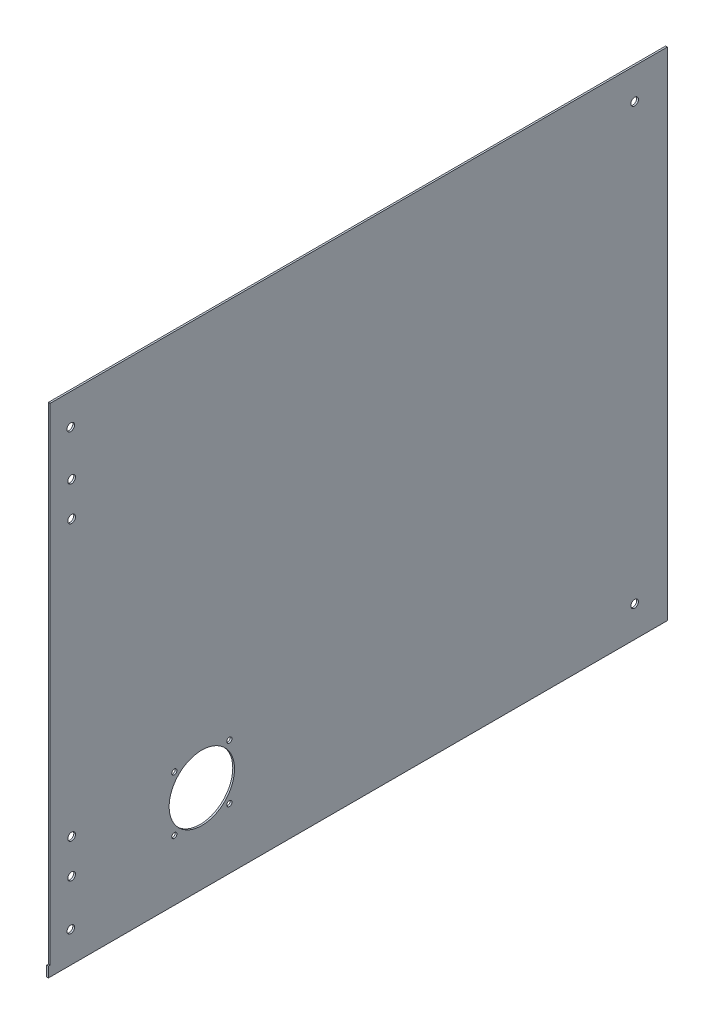
ISO-10303-21;
HEADER;
FILE_DESCRIPTION(('STEP AP214'),'2;1');
FILE_NAME('part.step','',(''),(''),'','','');
FILE_SCHEMA(('AUTOMOTIVE_DESIGN { 1 0 10303 214 1 1 1 1 }'));
ENDSEC;
DATA;
#1=APPLICATION_CONTEXT('core data for automotive mechanical design processes');
#2=APPLICATION_PROTOCOL_DEFINITION('international standard','automotive_design',2000,#1);
#3=PRODUCT_CONTEXT('',#1,'mechanical');
#4=PRODUCT('Part','Part','',(#3));
#5=PRODUCT_RELATED_PRODUCT_CATEGORY('part','',(#4));
#6=PRODUCT_DEFINITION_FORMATION('','',#4);
#7=PRODUCT_DEFINITION_CONTEXT('part definition',#1,'design');
#8=PRODUCT_DEFINITION('design','',#6,#7);
#9=PRODUCT_DEFINITION_SHAPE('','',#8);
#10=(LENGTH_UNIT() NAMED_UNIT(*) SI_UNIT(.MILLI.,.METRE.));
#11=(NAMED_UNIT(*) PLANE_ANGLE_UNIT() SI_UNIT($,.RADIAN.));
#12=(NAMED_UNIT(*) SI_UNIT($,.STERADIAN.) SOLID_ANGLE_UNIT());
#13=UNCERTAINTY_MEASURE_WITH_UNIT(LENGTH_MEASURE(1.E-05),#10,'distance_accuracy_value','');
#14=(GEOMETRIC_REPRESENTATION_CONTEXT(3) GLOBAL_UNCERTAINTY_ASSIGNED_CONTEXT((#13)) GLOBAL_UNIT_ASSIGNED_CONTEXT((#10,
#11,#12)) REPRESENTATION_CONTEXT('',''));
#15=CARTESIAN_POINT('',(0.,0.,0.));
#16=DIRECTION('',(0.,0.,1.));
#17=DIRECTION('',(1.,0.,0.));
#18=AXIS2_PLACEMENT_3D('',#15,#16,#17);
#19=CARTESIAN_POINT('',(1.,0.,0.));
#20=DIRECTION('',(1.,0.,0.));
#21=DIRECTION('',(0.,0.,-1.));
#22=AXIS2_PLACEMENT_3D('',#19,#20,#21);
#23=PLANE('',#22);
#24=DIRECTION('',(0.,1.,0.));
#25=VECTOR('',#24,1.);
#26=CARTESIAN_POINT('',(1.,141.5,179.));
#27=LINE('',#26,#25);
#28=CARTESIAN_POINT('',(1.,-141.5,179.));
#29=VERTEX_POINT('',#28);
#30=CARTESIAN_POINT('',(1.,141.5,179.));
#31=VERTEX_POINT('',#30);
#32=EDGE_CURVE('E53',#29,#31,#27,.T.);
#33=ORIENTED_EDGE('',*,*,#32,.F.);
#34=DIRECTION('',(0.,0.,-1.));
#35=VECTOR('',#34,1.);
#36=CARTESIAN_POINT('',(1.,-141.5,-180.));
#37=LINE('',#36,#35);
#38=CARTESIAN_POINT('',(1.,-141.5,180.));
#39=VERTEX_POINT('',#38);
#40=EDGE_CURVE('E96',#39,#29,#37,.T.);
#41=ORIENTED_EDGE('',*,*,#40,.F.);
#42=DIRECTION('',(0.,1.,0.));
#43=VECTOR('',#42,1.);
#44=CARTESIAN_POINT('',(1.,-141.5,180.));
#45=LINE('',#44,#43);
#46=CARTESIAN_POINT('',(1.,-147.5,180.));
#47=VERTEX_POINT('',#46);
#48=EDGE_CURVE('E95',#47,#39,#45,.T.);
#49=ORIENTED_EDGE('',*,*,#48,.F.);
#50=DIRECTION('',(0.,0.,1.));
#51=VECTOR('',#50,1.);
#52=CARTESIAN_POINT('',(1.,-147.5,-180.));
#53=LINE('',#52,#51);
#54=CARTESIAN_POINT('',(1.,-147.5,-180.));
#55=VERTEX_POINT('',#54);
#56=EDGE_CURVE('E98',#55,#47,#53,.T.);
#57=ORIENTED_EDGE('',*,*,#56,.F.);
#58=DIRECTION('',(0.,1.,0.));
#59=VECTOR('',#58,1.);
#60=CARTESIAN_POINT('',(1.,-141.5,-180.));
#61=LINE('',#60,#59);
#62=CARTESIAN_POINT('',(1.,141.5,-180.));
#63=VERTEX_POINT('',#62);
#64=EDGE_CURVE('E62',#55,#63,#61,.T.);
#65=ORIENTED_EDGE('',*,*,#64,.T.);
#66=DIRECTION('',(0.,0.,1.));
#67=VECTOR('',#66,1.);
#68=CARTESIAN_POINT('',(1.,141.5,-180.));
#69=LINE('',#68,#67);
#70=EDGE_CURVE('E50',#63,#31,#69,.T.);
#71=ORIENTED_EDGE('',*,*,#70,.T.);
#72=EDGE_LOOP('',(#33,#41,#49,#57,#65,#71));
#73=FACE_BOUND('',#72,.T.);
#74=CARTESIAN_POINT('',(1.,-112.29917955335,106.763094032726));
#75=DIRECTION('',(1.,0.,0.));
#76=DIRECTION('',(0.,0.,-1.));
#77=AXIS2_PLACEMENT_3D('',#74,#75,#76);
#78=CIRCLE('',#77,1.49999999292245);
#79=CARTESIAN_POINT('',(1.,-112.29917955335,105.263094039804));
#80=VERTEX_POINT('',#79);
#81=EDGE_CURVE('E144',#80,#80,#78,.T.);
#82=ORIENTED_EDGE('',*,*,#81,.F.);
#83=EDGE_LOOP('',(#82));
#84=FACE_BOUND('',#83,.T.);
#85=CARTESIAN_POINT('',(1.,-112.29917955335,74.7630940327262));
#86=DIRECTION('',(1.,0.,0.));
#87=DIRECTION('',(0.,0.,-1.));
#88=AXIS2_PLACEMENT_3D('',#85,#86,#87);
#89=CIRCLE('',#88,1.49999999292245);
#90=CARTESIAN_POINT('',(1.,-112.29917955335,73.2630940398037));
#91=VERTEX_POINT('',#90);
#92=EDGE_CURVE('E137',#91,#91,#89,.T.);
#93=ORIENTED_EDGE('',*,*,#92,.F.);
#94=EDGE_LOOP('',(#93));
#95=FACE_BOUND('',#94,.T.);
#96=CARTESIAN_POINT('',(1.,-80.2991795533498,74.7630940327262));
#97=DIRECTION('',(1.,0.,0.));
#98=DIRECTION('',(0.,0.,-1.));
#99=AXIS2_PLACEMENT_3D('',#96,#97,#98);
#100=CIRCLE('',#99,1.49999999292245);
#101=CARTESIAN_POINT('',(1.,-80.2991795533498,73.2630940398037));
#102=VERTEX_POINT('',#101);
#103=EDGE_CURVE('E133',#102,#102,#100,.T.);
#104=ORIENTED_EDGE('',*,*,#103,.F.);
#105=EDGE_LOOP('',(#104));
#106=FACE_BOUND('',#105,.T.);
#107=CARTESIAN_POINT('',(1.,-80.2991795533498,106.763094032726));
#108=DIRECTION('',(1.,0.,0.));
#109=DIRECTION('',(0.,0.,-1.));
#110=AXIS2_PLACEMENT_3D('',#107,#108,#109);
#111=CIRCLE('',#110,1.49999999292265);
#112=CARTESIAN_POINT('',(1.,-80.2991795533498,105.263094039804));
#113=VERTEX_POINT('',#112);
#114=EDGE_CURVE('E126',#113,#113,#111,.T.);
#115=ORIENTED_EDGE('',*,*,#114,.F.);
#116=EDGE_LOOP('',(#115));
#117=FACE_BOUND('',#116,.T.);
#118=CARTESIAN_POINT('',(1.,-96.2991795533498,90.7630940327262));
#119=DIRECTION('',(1.,0.,0.));
#120=DIRECTION('',(0.,0.,-1.));
#121=AXIS2_PLACEMENT_3D('',#118,#119,#120);
#122=CIRCLE('',#121,18.9999999929224);
#123=CARTESIAN_POINT('',(1.,-96.2991795533498,71.7630940398038));
#124=VERTEX_POINT('',#123);
#125=EDGE_CURVE('E132',#124,#124,#122,.T.);
#126=ORIENTED_EDGE('',*,*,#125,.F.);
#127=EDGE_LOOP('',(#126));
#128=FACE_BOUND('',#127,.T.);
#129=CARTESIAN_POINT('',(1.,-82.9991795533211,166.500000000124));
#130=DIRECTION('',(1.,0.,0.));
#131=DIRECTION('',(0.,0.,-1.));
#132=AXIS2_PLACEMENT_3D('',#129,#130,#131);
#133=CIRCLE('',#132,2.25000000000001);
#134=CARTESIAN_POINT('',(1.,-82.9991795533211,164.250000000124));
#135=VERTEX_POINT('',#134);
#136=EDGE_CURVE('E171',#135,#135,#133,.T.);
#137=ORIENTED_EDGE('',*,*,#136,.F.);
#138=EDGE_LOOP('',(#137));
#139=FACE_BOUND('',#138,.T.);
#140=CARTESIAN_POINT('',(1.,-129.5,-161.));
#141=DIRECTION('',(1.,0.,0.));
#142=DIRECTION('',(0.,0.,1.));
#143=AXIS2_PLACEMENT_3D('',#140,#141,#142);
#144=CIRCLE('',#143,2.20000000000001);
#145=CARTESIAN_POINT('',(1.,-129.5,-158.8));
#146=VERTEX_POINT('',#145);
#147=EDGE_CURVE('E182',#146,#146,#144,.T.);
#148=ORIENTED_EDGE('',*,*,#147,.F.);
#149=EDGE_LOOP('',(#148));
#150=FACE_BOUND('',#149,.T.);
#151=CARTESIAN_POINT('',(1.,97.0008204466789,166.500000000125));
#152=DIRECTION('',(1.,0.,0.));
#153=DIRECTION('',(0.,0.,-1.));
#154=AXIS2_PLACEMENT_3D('',#151,#152,#153);
#155=CIRCLE('',#154,2.25000000000001);
#156=CARTESIAN_POINT('',(1.,97.0008204466789,164.250000000125));
#157=VERTEX_POINT('',#156);
#158=EDGE_CURVE('E191',#157,#157,#155,.T.);
#159=ORIENTED_EDGE('',*,*,#158,.F.);
#160=EDGE_LOOP('',(#159));
#161=FACE_BOUND('',#160,.T.);
#162=CARTESIAN_POINT('',(1.,123.5,167.));
#163=DIRECTION('',(1.,0.,0.));
#164=DIRECTION('',(0.,0.,-1.));
#165=AXIS2_PLACEMENT_3D('',#162,#163,#164);
#166=CIRCLE('',#165,2.20000000000001);
#167=CARTESIAN_POINT('',(1.,123.5,164.8));
#168=VERTEX_POINT('',#167);
#169=EDGE_CURVE('E210',#168,#168,#166,.T.);
#170=ORIENTED_EDGE('',*,*,#169,.F.);
#171=EDGE_LOOP('',(#170));
#172=FACE_BOUND('',#171,.T.);
#173=CARTESIAN_POINT('',(1.,-129.5,167.));
#174=DIRECTION('',(1.,0.,0.));
#175=DIRECTION('',(0.,0.,-1.));
#176=AXIS2_PLACEMENT_3D('',#173,#174,#175);
#177=CIRCLE('',#176,2.20000000000001);
#178=CARTESIAN_POINT('',(1.,-129.5,164.8));
#179=VERTEX_POINT('',#178);
#180=EDGE_CURVE('E201',#179,#179,#177,.T.);
#181=ORIENTED_EDGE('',*,*,#180,.F.);
#182=EDGE_LOOP('',(#181));
#183=FACE_BOUND('',#182,.T.);
#184=CARTESIAN_POINT('',(1.,123.5,-161.));
#185=DIRECTION('',(1.,0.,0.));
#186=DIRECTION('',(0.,0.,1.));
#187=AXIS2_PLACEMENT_3D('',#184,#185,#186);
#188=CIRCLE('',#187,2.20000000000001);
#189=CARTESIAN_POINT('',(1.,123.5,-158.8));
#190=VERTEX_POINT('',#189);
#191=EDGE_CURVE('E186',#190,#190,#188,.T.);
#192=ORIENTED_EDGE('',*,*,#191,.F.);
#193=EDGE_LOOP('',(#192));
#194=FACE_BOUND('',#193,.T.);
#195=CARTESIAN_POINT('',(1.,77.0008204466789,166.500000000124));
#196=DIRECTION('',(1.,0.,0.));
#197=DIRECTION('',(0.,0.,-1.));
#198=AXIS2_PLACEMENT_3D('',#195,#196,#197);
#199=CIRCLE('',#198,2.25000000000001);
#200=CARTESIAN_POINT('',(1.,77.0008204466789,164.250000000124));
#201=VERTEX_POINT('',#200);
#202=EDGE_CURVE('E180',#201,#201,#199,.T.);
#203=ORIENTED_EDGE('',*,*,#202,.F.);
#204=EDGE_LOOP('',(#203));
#205=FACE_BOUND('',#204,.T.);
#206=CARTESIAN_POINT('',(1.,-102.999179553321,166.500000000124));
#207=DIRECTION('',(1.,0.,0.));
#208=DIRECTION('',(0.,0.,-1.));
#209=AXIS2_PLACEMENT_3D('',#206,#207,#208);
#210=CIRCLE('',#209,2.25000000000001);
#211=CARTESIAN_POINT('',(1.,-102.999179553321,164.250000000124));
#212=VERTEX_POINT('',#211);
#213=EDGE_CURVE('E164',#212,#212,#210,.T.);
#214=ORIENTED_EDGE('',*,*,#213,.F.);
#215=EDGE_LOOP('',(#214));
#216=FACE_BOUND('',#215,.T.);
#217=ADVANCED_FACE('F39',(#73,#84,#95,#106,#117,#128,#139,#150,#161,#172,#183,#194,#205,#216),
#23,.T.);
#218=CARTESIAN_POINT('',(0.,0.,0.));
#219=DIRECTION('',(1.,0.,0.));
#220=DIRECTION('',(0.,0.,-1.));
#221=AXIS2_PLACEMENT_3D('',#218,#219,#220);
#222=PLANE('',#221);
#223=CARTESIAN_POINT('',(0.,-112.29917955335,106.763094032726));
#224=DIRECTION('',(1.,0.,0.));
#225=DIRECTION('',(0.,0.,-1.));
#226=AXIS2_PLACEMENT_3D('',#223,#224,#225);
#227=CIRCLE('',#226,1.49999999292245);
#228=CARTESIAN_POINT('',(0.,-112.29917955335,105.263094039804));
#229=VERTEX_POINT('',#228);
#230=EDGE_CURVE('E149',#229,#229,#227,.F.);
#231=ORIENTED_EDGE('',*,*,#230,.F.);
#232=EDGE_LOOP('',(#231));
#233=FACE_BOUND('',#232,.T.);
#234=CARTESIAN_POINT('',(0.,-112.29917955335,74.7630940327262));
#235=DIRECTION('',(1.,0.,0.));
#236=DIRECTION('',(0.,0.,-1.));
#237=AXIS2_PLACEMENT_3D('',#234,#235,#236);
#238=CIRCLE('',#237,1.49999999292245);
#239=CARTESIAN_POINT('',(0.,-112.29917955335,73.2630940398037));
#240=VERTEX_POINT('',#239);
#241=EDGE_CURVE('E142',#240,#240,#238,.F.);
#242=ORIENTED_EDGE('',*,*,#241,.F.);
#243=EDGE_LOOP('',(#242));
#244=FACE_BOUND('',#243,.T.);
#245=CARTESIAN_POINT('',(0.,-80.2991795533498,74.7630940327262));
#246=DIRECTION('',(1.,0.,0.));
#247=DIRECTION('',(0.,0.,-1.));
#248=AXIS2_PLACEMENT_3D('',#245,#246,#247);
#249=CIRCLE('',#248,1.49999999292245);
#250=CARTESIAN_POINT('',(0.,-80.2991795533498,73.2630940398037));
#251=VERTEX_POINT('',#250);
#252=EDGE_CURVE('E134',#251,#251,#249,.F.);
#253=ORIENTED_EDGE('',*,*,#252,.F.);
#254=EDGE_LOOP('',(#253));
#255=FACE_BOUND('',#254,.T.);
#256=CARTESIAN_POINT('',(0.,-80.2991795533498,106.763094032726));
#257=DIRECTION('',(1.,0.,0.));
#258=DIRECTION('',(0.,0.,-1.));
#259=AXIS2_PLACEMENT_3D('',#256,#257,#258);
#260=CIRCLE('',#259,1.49999999292265);
#261=CARTESIAN_POINT('',(0.,-80.2991795533498,105.263094039804));
#262=VERTEX_POINT('',#261);
#263=EDGE_CURVE('E129',#262,#262,#260,.F.);
#264=ORIENTED_EDGE('',*,*,#263,.F.);
#265=EDGE_LOOP('',(#264));
#266=FACE_BOUND('',#265,.T.);
#267=CARTESIAN_POINT('',(0.,-96.2991795533498,90.7630940327262));
#268=DIRECTION('',(1.,0.,0.));
#269=DIRECTION('',(0.,0.,-1.));
#270=AXIS2_PLACEMENT_3D('',#267,#268,#269);
#271=CIRCLE('',#270,18.9999999929224);
#272=CARTESIAN_POINT('',(0.,-96.2991795533498,71.7630940398038));
#273=VERTEX_POINT('',#272);
#274=EDGE_CURVE('E163',#273,#273,#271,.F.);
#275=ORIENTED_EDGE('',*,*,#274,.F.);
#276=EDGE_LOOP('',(#275));
#277=FACE_BOUND('',#276,.T.);
#278=DIRECTION('',(0.,1.,0.));
#279=VECTOR('',#278,1.);
#280=CARTESIAN_POINT('',(0.,-141.5,-180.));
#281=LINE('',#280,#279);
#282=CARTESIAN_POINT('',(0.,-147.5,-180.));
#283=VERTEX_POINT('',#282);
#284=CARTESIAN_POINT('',(0.,141.5,-180.));
#285=VERTEX_POINT('',#284);
#286=EDGE_CURVE('E208',#283,#285,#281,.T.);
#287=ORIENTED_EDGE('',*,*,#286,.F.);
#288=DIRECTION('',(0.,0.,1.));
#289=VECTOR('',#288,1.);
#290=CARTESIAN_POINT('',(0.,-147.5,-180.));
#291=LINE('',#290,#289);
#292=CARTESIAN_POINT('',(0.,-147.5,180.));
#293=VERTEX_POINT('',#292);
#294=EDGE_CURVE('E122',#283,#293,#291,.T.);
#295=ORIENTED_EDGE('',*,*,#294,.T.);
#296=DIRECTION('',(0.,1.,0.));
#297=VECTOR('',#296,1.);
#298=CARTESIAN_POINT('',(0.,-141.5,180.));
#299=LINE('',#298,#297);
#300=CARTESIAN_POINT('',(0.,-141.5,180.));
#301=VERTEX_POINT('',#300);
#302=EDGE_CURVE('E110',#293,#301,#299,.T.);
#303=ORIENTED_EDGE('',*,*,#302,.T.);
#304=DIRECTION('',(0.,0.,-1.));
#305=VECTOR('',#304,1.);
#306=CARTESIAN_POINT('',(0.,-141.5,-180.));
#307=LINE('',#306,#305);
#308=CARTESIAN_POINT('',(0.,-141.5,179.));
#309=VERTEX_POINT('',#308);
#310=EDGE_CURVE('E114',#301,#309,#307,.T.);
#311=ORIENTED_EDGE('',*,*,#310,.T.);
#312=DIRECTION('',(0.,-1.,0.));
#313=VECTOR('',#312,1.);
#314=CARTESIAN_POINT('',(0.,141.5,179.));
#315=LINE('',#314,#313);
#316=CARTESIAN_POINT('',(0.,141.5,179.));
#317=VERTEX_POINT('',#316);
#318=EDGE_CURVE('E128',#317,#309,#315,.T.);
#319=ORIENTED_EDGE('',*,*,#318,.F.);
#320=DIRECTION('',(0.,0.,1.));
#321=VECTOR('',#320,1.);
#322=CARTESIAN_POINT('',(0.,141.5,-180.));
#323=LINE('',#322,#321);
#324=EDGE_CURVE('E215',#285,#317,#323,.T.);
#325=ORIENTED_EDGE('',*,*,#324,.F.);
#326=EDGE_LOOP('',(#287,#295,#303,#311,#319,#325));
#327=FACE_BOUND('',#326,.T.);
#328=CARTESIAN_POINT('',(0.,123.5,167.));
#329=DIRECTION('',(1.,0.,0.));
#330=DIRECTION('',(0.,0.,-1.));
#331=AXIS2_PLACEMENT_3D('',#328,#329,#330);
#332=CIRCLE('',#331,2.20000000000001);
#333=CARTESIAN_POINT('',(0.,123.5,164.8));
#334=VERTEX_POINT('',#333);
#335=EDGE_CURVE('E203',#334,#334,#332,.T.);
#336=ORIENTED_EDGE('',*,*,#335,.T.);
#337=EDGE_LOOP('',(#336));
#338=FACE_BOUND('',#337,.T.);
#339=CARTESIAN_POINT('',(0.,-129.5,167.));
#340=DIRECTION('',(1.,0.,0.));
#341=DIRECTION('',(0.,0.,-1.));
#342=AXIS2_PLACEMENT_3D('',#339,#340,#341);
#343=CIRCLE('',#342,2.20000000000001);
#344=CARTESIAN_POINT('',(0.,-129.5,164.8));
#345=VERTEX_POINT('',#344);
#346=EDGE_CURVE('E196',#345,#345,#343,.T.);
#347=ORIENTED_EDGE('',*,*,#346,.T.);
#348=EDGE_LOOP('',(#347));
#349=FACE_BOUND('',#348,.T.);
#350=CARTESIAN_POINT('',(0.,97.0008204466789,166.500000000125));
#351=DIRECTION('',(1.,0.,0.));
#352=DIRECTION('',(0.,0.,-1.));
#353=AXIS2_PLACEMENT_3D('',#350,#351,#352);
#354=CIRCLE('',#353,2.25000000000001);
#355=CARTESIAN_POINT('',(0.,97.0008204466789,164.250000000125));
#356=VERTEX_POINT('',#355);
#357=EDGE_CURVE('E194',#356,#356,#354,.T.);
#358=ORIENTED_EDGE('',*,*,#357,.T.);
#359=EDGE_LOOP('',(#358));
#360=FACE_BOUND('',#359,.T.);
#361=CARTESIAN_POINT('',(0.,123.5,-161.));
#362=DIRECTION('',(1.,0.,0.));
#363=DIRECTION('',(0.,0.,1.));
#364=AXIS2_PLACEMENT_3D('',#361,#362,#363);
#365=CIRCLE('',#364,2.20000000000001);
#366=CARTESIAN_POINT('',(0.,123.5,-158.8));
#367=VERTEX_POINT('',#366);
#368=EDGE_CURVE('E187',#367,#367,#365,.T.);
#369=ORIENTED_EDGE('',*,*,#368,.T.);
#370=EDGE_LOOP('',(#369));
#371=FACE_BOUND('',#370,.T.);
#372=CARTESIAN_POINT('',(0.,-129.5,-161.));
#373=DIRECTION('',(1.,0.,0.));
#374=DIRECTION('',(0.,0.,1.));
#375=AXIS2_PLACEMENT_3D('',#372,#373,#374);
#376=CIRCLE('',#375,2.20000000000001);
#377=CARTESIAN_POINT('',(0.,-129.5,-158.8));
#378=VERTEX_POINT('',#377);
#379=EDGE_CURVE('E179',#378,#378,#376,.T.);
#380=ORIENTED_EDGE('',*,*,#379,.T.);
#381=EDGE_LOOP('',(#380));
#382=FACE_BOUND('',#381,.T.);
#383=CARTESIAN_POINT('',(0.,77.0008204466789,166.500000000124));
#384=DIRECTION('',(1.,0.,0.));
#385=DIRECTION('',(0.,0.,-1.));
#386=AXIS2_PLACEMENT_3D('',#383,#384,#385);
#387=CIRCLE('',#386,2.25000000000001);
#388=CARTESIAN_POINT('',(0.,77.0008204466789,164.250000000124));
#389=VERTEX_POINT('',#388);
#390=EDGE_CURVE('E172',#389,#389,#387,.T.);
#391=ORIENTED_EDGE('',*,*,#390,.T.);
#392=EDGE_LOOP('',(#391));
#393=FACE_BOUND('',#392,.T.);
#394=CARTESIAN_POINT('',(0.,-82.9991795533211,166.500000000124));
#395=DIRECTION('',(1.,0.,0.));
#396=DIRECTION('',(0.,0.,-1.));
#397=AXIS2_PLACEMENT_3D('',#394,#395,#396);
#398=CIRCLE('',#397,2.25000000000001);
#399=CARTESIAN_POINT('',(0.,-82.9991795533211,164.250000000124));
#400=VERTEX_POINT('',#399);
#401=EDGE_CURVE('E166',#400,#400,#398,.T.);
#402=ORIENTED_EDGE('',*,*,#401,.T.);
#403=EDGE_LOOP('',(#402));
#404=FACE_BOUND('',#403,.T.);
#405=CARTESIAN_POINT('',(0.,-102.999179553321,166.500000000124));
#406=DIRECTION('',(1.,0.,0.));
#407=DIRECTION('',(0.,0.,-1.));
#408=AXIS2_PLACEMENT_3D('',#405,#406,#407);
#409=CIRCLE('',#408,2.25000000000001);
#410=CARTESIAN_POINT('',(0.,-102.999179553321,164.250000000124));
#411=VERTEX_POINT('',#410);
#412=EDGE_CURVE('E165',#411,#411,#409,.T.);
#413=ORIENTED_EDGE('',*,*,#412,.T.);
#414=EDGE_LOOP('',(#413));
#415=FACE_BOUND('',#414,.T.);
#416=ADVANCED_FACE('F222',(#233,#244,#255,#266,#277,#327,#338,#349,#360,#371,#382,#393,#404,
#415),#222,.F.);
#417=CARTESIAN_POINT('',(1.,-141.5,-180.));
#418=DIRECTION('',(0.,0.,1.));
#419=DIRECTION('',(1.,0.,0.));
#420=AXIS2_PLACEMENT_3D('',#417,#418,#419);
#421=PLANE('',#420);
#422=ORIENTED_EDGE('',*,*,#286,.T.);
#423=DIRECTION('',(-1.,0.,0.));
#424=VECTOR('',#423,1.);
#425=CARTESIAN_POINT('',(1.,141.5,-180.));
#426=LINE('',#425,#424);
#427=EDGE_CURVE('E11',#63,#285,#426,.T.);
#428=ORIENTED_EDGE('',*,*,#427,.F.);
#429=ORIENTED_EDGE('',*,*,#64,.F.);
#430=DIRECTION('',(-1.,0.,0.));
#431=VECTOR('',#430,1.);
#432=CARTESIAN_POINT('',(361.04999652826,-147.5,-180.));
#433=LINE('',#432,#431);
#434=EDGE_CURVE('E112',#55,#283,#433,.T.);
#435=ORIENTED_EDGE('',*,*,#434,.T.);
#436=EDGE_LOOP('',(#422,#428,#429,#435));
#437=FACE_BOUND('',#436,.T.);
#438=ADVANCED_FACE('F41',(#437),#421,.F.);
#439=CARTESIAN_POINT('',(1.,141.5,-180.));
#440=DIRECTION('',(0.,-1.,0.));
#441=DIRECTION('',(0.,0.,-1.));
#442=AXIS2_PLACEMENT_3D('',#439,#440,#441);
#443=PLANE('',#442);
#444=ORIENTED_EDGE('',*,*,#324,.T.);
#445=DIRECTION('',(1.,0.,0.));
#446=VECTOR('',#445,1.);
#447=CARTESIAN_POINT('',(-283.001766778937,141.5,179.));
#448=LINE('',#447,#446);
#449=EDGE_CURVE('E152',#317,#31,#448,.T.);
#450=ORIENTED_EDGE('',*,*,#449,.T.);
#451=ORIENTED_EDGE('',*,*,#70,.F.);
#452=ORIENTED_EDGE('',*,*,#427,.T.);
#453=EDGE_LOOP('',(#444,#450,#451,#452));
#454=FACE_BOUND('',#453,.T.);
#455=ADVANCED_FACE('F217',(#454),#443,.F.);
#456=CARTESIAN_POINT('',(1.,123.5,167.));
#457=DIRECTION('',(-1.,0.,0.));
#458=DIRECTION('',(0.,0.,1.));
#459=AXIS2_PLACEMENT_3D('',#456,#457,#458);
#460=CYLINDRICAL_SURFACE('',#459,2.20000000000001);
#461=ORIENTED_EDGE('',*,*,#169,.T.);
#462=EDGE_LOOP('',(#461));
#463=FACE_BOUND('',#462,.T.);
#464=ORIENTED_EDGE('',*,*,#335,.F.);
#465=EDGE_LOOP('',(#464));
#466=FACE_BOUND('',#465,.T.);
#467=ADVANCED_FACE('F249',(#463,#466),#460,.F.);
#468=CARTESIAN_POINT('',(1.,-129.5,167.));
#469=DIRECTION('',(-1.,0.,0.));
#470=DIRECTION('',(0.,0.,1.));
#471=AXIS2_PLACEMENT_3D('',#468,#469,#470);
#472=CYLINDRICAL_SURFACE('',#471,2.20000000000001);
#473=ORIENTED_EDGE('',*,*,#180,.T.);
#474=EDGE_LOOP('',(#473));
#475=FACE_BOUND('',#474,.T.);
#476=ORIENTED_EDGE('',*,*,#346,.F.);
#477=EDGE_LOOP('',(#476));
#478=FACE_BOUND('',#477,.T.);
#479=ADVANCED_FACE('F257',(#475,#478),#472,.F.);
#480=CARTESIAN_POINT('',(1.,97.0008204466789,166.500000000125));
#481=DIRECTION('',(-1.,0.,0.));
#482=DIRECTION('',(0.,0.,1.));
#483=AXIS2_PLACEMENT_3D('',#480,#481,#482);
#484=CYLINDRICAL_SURFACE('',#483,2.25000000000001);
#485=ORIENTED_EDGE('',*,*,#158,.T.);
#486=EDGE_LOOP('',(#485));
#487=FACE_BOUND('',#486,.T.);
#488=ORIENTED_EDGE('',*,*,#357,.F.);
#489=EDGE_LOOP('',(#488));
#490=FACE_BOUND('',#489,.T.);
#491=ADVANCED_FACE('F359',(#487,#490),#484,.F.);
#492=CARTESIAN_POINT('',(1.,123.5,-161.));
#493=DIRECTION('',(-1.,0.,0.));
#494=DIRECTION('',(0.,0.,1.));
#495=AXIS2_PLACEMENT_3D('',#492,#493,#494);
#496=CYLINDRICAL_SURFACE('',#495,2.20000000000001);
#497=ORIENTED_EDGE('',*,*,#191,.T.);
#498=EDGE_LOOP('',(#497));
#499=FACE_BOUND('',#498,.T.);
#500=ORIENTED_EDGE('',*,*,#368,.F.);
#501=EDGE_LOOP('',(#500));
#502=FACE_BOUND('',#501,.T.);
#503=ADVANCED_FACE('F367',(#499,#502),#496,.F.);
#504=CARTESIAN_POINT('',(1.,-129.5,-161.));
#505=DIRECTION('',(-1.,0.,0.));
#506=DIRECTION('',(0.,0.,1.));
#507=AXIS2_PLACEMENT_3D('',#504,#505,#506);
#508=CYLINDRICAL_SURFACE('',#507,2.20000000000001);
#509=ORIENTED_EDGE('',*,*,#147,.T.);
#510=EDGE_LOOP('',(#509));
#511=FACE_BOUND('',#510,.T.);
#512=ORIENTED_EDGE('',*,*,#379,.F.);
#513=EDGE_LOOP('',(#512));
#514=FACE_BOUND('',#513,.T.);
#515=ADVANCED_FACE('F378',(#511,#514),#508,.F.);
#516=CARTESIAN_POINT('',(1.,77.0008204466789,166.500000000124));
#517=DIRECTION('',(-1.,0.,0.));
#518=DIRECTION('',(0.,0.,1.));
#519=AXIS2_PLACEMENT_3D('',#516,#517,#518);
#520=CYLINDRICAL_SURFACE('',#519,2.25000000000001);
#521=ORIENTED_EDGE('',*,*,#202,.T.);
#522=EDGE_LOOP('',(#521));
#523=FACE_BOUND('',#522,.T.);
#524=ORIENTED_EDGE('',*,*,#390,.F.);
#525=EDGE_LOOP('',(#524));
#526=FACE_BOUND('',#525,.T.);
#527=ADVANCED_FACE('F390',(#523,#526),#520,.F.);
#528=CARTESIAN_POINT('',(1.,-82.9991795533211,166.500000000124));
#529=DIRECTION('',(-1.,0.,0.));
#530=DIRECTION('',(0.,0.,1.));
#531=AXIS2_PLACEMENT_3D('',#528,#529,#530);
#532=CYLINDRICAL_SURFACE('',#531,2.25000000000001);
#533=ORIENTED_EDGE('',*,*,#136,.T.);
#534=EDGE_LOOP('',(#533));
#535=FACE_BOUND('',#534,.T.);
#536=ORIENTED_EDGE('',*,*,#401,.F.);
#537=EDGE_LOOP('',(#536));
#538=FACE_BOUND('',#537,.T.);
#539=ADVANCED_FACE('F397',(#535,#538),#532,.F.);
#540=CARTESIAN_POINT('',(1.,-102.999179553321,166.500000000124));
#541=DIRECTION('',(-1.,0.,0.));
#542=DIRECTION('',(0.,0.,1.));
#543=AXIS2_PLACEMENT_3D('',#540,#541,#542);
#544=CYLINDRICAL_SURFACE('',#543,2.25000000000001);
#545=ORIENTED_EDGE('',*,*,#213,.T.);
#546=EDGE_LOOP('',(#545));
#547=FACE_BOUND('',#546,.T.);
#548=ORIENTED_EDGE('',*,*,#412,.F.);
#549=EDGE_LOOP('',(#548));
#550=FACE_BOUND('',#549,.T.);
#551=ADVANCED_FACE('F275',(#547,#550),#544,.F.);
#552=CARTESIAN_POINT('',(-283.001766778937,141.5,179.));
#553=DIRECTION('',(0.,0.,-1.));
#554=DIRECTION('',(0.,1.,0.));
#555=AXIS2_PLACEMENT_3D('',#552,#553,#554);
#556=PLANE('',#555);
#557=ORIENTED_EDGE('',*,*,#318,.T.);
#558=DIRECTION('',(1.,0.,0.));
#559=VECTOR('',#558,1.);
#560=CARTESIAN_POINT('',(-283.001766778937,-141.5,179.));
#561=LINE('',#560,#559);
#562=EDGE_CURVE('E155',#309,#29,#561,.T.);
#563=ORIENTED_EDGE('',*,*,#562,.T.);
#564=ORIENTED_EDGE('',*,*,#32,.T.);
#565=ORIENTED_EDGE('',*,*,#449,.F.);
#566=EDGE_LOOP('',(#557,#563,#564,#565));
#567=FACE_BOUND('',#566,.T.);
#568=ADVANCED_FACE('F228',(#567),#556,.F.);
#569=CARTESIAN_POINT('',(-283.001766778937,-96.2991795533498,90.7630940327262));
#570=DIRECTION('',(1.,0.,0.));
#571=DIRECTION('',(0.,0.,-1.));
#572=AXIS2_PLACEMENT_3D('',#569,#570,#571);
#573=CYLINDRICAL_SURFACE('',#572,18.9999999929224);
#574=ORIENTED_EDGE('',*,*,#274,.T.);
#575=EDGE_LOOP('',(#574));
#576=FACE_BOUND('',#575,.T.);
#577=ORIENTED_EDGE('',*,*,#125,.T.);
#578=EDGE_LOOP('',(#577));
#579=FACE_BOUND('',#578,.T.);
#580=ADVANCED_FACE('F272',(#576,#579),#573,.F.);
#581=CARTESIAN_POINT('',(-283.001766778937,-80.2991795533498,106.763094032726));
#582=DIRECTION('',(1.,0.,0.));
#583=DIRECTION('',(0.,0.,-1.));
#584=AXIS2_PLACEMENT_3D('',#581,#582,#583);
#585=CYLINDRICAL_SURFACE('',#584,1.49999999292265);
#586=ORIENTED_EDGE('',*,*,#263,.T.);
#587=EDGE_LOOP('',(#586));
#588=FACE_BOUND('',#587,.T.);
#589=ORIENTED_EDGE('',*,*,#114,.T.);
#590=EDGE_LOOP('',(#589));
#591=FACE_BOUND('',#590,.T.);
#592=ADVANCED_FACE('F287',(#588,#591),#585,.F.);
#593=CARTESIAN_POINT('',(-283.001766778937,-80.2991795533498,74.7630940327262));
#594=DIRECTION('',(1.,0.,0.));
#595=DIRECTION('',(0.,0.,-1.));
#596=AXIS2_PLACEMENT_3D('',#593,#594,#595);
#597=CYLINDRICAL_SURFACE('',#596,1.49999999292245);
#598=ORIENTED_EDGE('',*,*,#252,.T.);
#599=EDGE_LOOP('',(#598));
#600=FACE_BOUND('',#599,.T.);
#601=ORIENTED_EDGE('',*,*,#103,.T.);
#602=EDGE_LOOP('',(#601));
#603=FACE_BOUND('',#602,.T.);
#604=ADVANCED_FACE('F296',(#600,#603),#597,.F.);
#605=CARTESIAN_POINT('',(-283.001766778937,-112.29917955335,74.7630940327262));
#606=DIRECTION('',(1.,0.,0.));
#607=DIRECTION('',(0.,0.,-1.));
#608=AXIS2_PLACEMENT_3D('',#605,#606,#607);
#609=CYLINDRICAL_SURFACE('',#608,1.49999999292245);
#610=ORIENTED_EDGE('',*,*,#241,.T.);
#611=EDGE_LOOP('',(#610));
#612=FACE_BOUND('',#611,.T.);
#613=ORIENTED_EDGE('',*,*,#92,.T.);
#614=EDGE_LOOP('',(#613));
#615=FACE_BOUND('',#614,.T.);
#616=ADVANCED_FACE('F238',(#612,#615),#609,.F.);
#617=CARTESIAN_POINT('',(-283.001766778937,-112.29917955335,106.763094032726));
#618=DIRECTION('',(1.,0.,0.));
#619=DIRECTION('',(0.,0.,-1.));
#620=AXIS2_PLACEMENT_3D('',#617,#618,#619);
#621=CYLINDRICAL_SURFACE('',#620,1.49999999292245);
#622=ORIENTED_EDGE('',*,*,#230,.T.);
#623=EDGE_LOOP('',(#622));
#624=FACE_BOUND('',#623,.T.);
#625=ORIENTED_EDGE('',*,*,#81,.T.);
#626=EDGE_LOOP('',(#625));
#627=FACE_BOUND('',#626,.T.);
#628=ADVANCED_FACE('F229',(#624,#627),#621,.F.);
#629=CARTESIAN_POINT('',(361.04999652826,-141.5,-180.));
#630=DIRECTION('',(0.,1.,0.));
#631=DIRECTION('',(0.,0.,1.));
#632=AXIS2_PLACEMENT_3D('',#629,#630,#631);
#633=PLANE('',#632);
#634=ORIENTED_EDGE('',*,*,#562,.F.);
#635=ORIENTED_EDGE('',*,*,#310,.F.);
#636=DIRECTION('',(-1.,0.,0.));
#637=VECTOR('',#636,1.);
#638=CARTESIAN_POINT('',(361.04999652826,-141.5,180.));
#639=LINE('',#638,#637);
#640=EDGE_CURVE('E103',#39,#301,#639,.T.);
#641=ORIENTED_EDGE('',*,*,#640,.F.);
#642=ORIENTED_EDGE('',*,*,#40,.T.);
#643=EDGE_LOOP('',(#634,#635,#641,#642));
#644=FACE_BOUND('',#643,.T.);
#645=ADVANCED_FACE('F226',(#644),#633,.T.);
#646=CARTESIAN_POINT('',(361.04999652826,-147.5,-180.));
#647=DIRECTION('',(0.,-1.,0.));
#648=DIRECTION('',(0.,0.,-1.));
#649=AXIS2_PLACEMENT_3D('',#646,#647,#648);
#650=PLANE('',#649);
#651=ORIENTED_EDGE('',*,*,#434,.F.);
#652=ORIENTED_EDGE('',*,*,#56,.T.);
#653=DIRECTION('',(-1.,0.,0.));
#654=VECTOR('',#653,1.);
#655=CARTESIAN_POINT('',(361.04999652826,-147.5,180.));
#656=LINE('',#655,#654);
#657=EDGE_CURVE('E105',#47,#293,#656,.T.);
#658=ORIENTED_EDGE('',*,*,#657,.T.);
#659=ORIENTED_EDGE('',*,*,#294,.F.);
#660=EDGE_LOOP('',(#651,#652,#658,#659));
#661=FACE_BOUND('',#660,.T.);
#662=ADVANCED_FACE('F115',(#661),#650,.T.);
#663=CARTESIAN_POINT('',(361.04999652826,-141.5,180.));
#664=DIRECTION('',(0.,0.,1.));
#665=DIRECTION('',(1.,0.,0.));
#666=AXIS2_PLACEMENT_3D('',#663,#664,#665);
#667=PLANE('',#666);
#668=ORIENTED_EDGE('',*,*,#657,.F.);
#669=ORIENTED_EDGE('',*,*,#48,.T.);
#670=ORIENTED_EDGE('',*,*,#640,.T.);
#671=ORIENTED_EDGE('',*,*,#302,.F.);
#672=EDGE_LOOP('',(#668,#669,#670,#671));
#673=FACE_BOUND('',#672,.T.);
#674=ADVANCED_FACE('F102',(#673),#667,.T.);
#675=CLOSED_SHELL('',(#217,#416,#438,#455,#467,#479,#491,#503,#515,#527,#539,#551,#568,#580,
#592,#604,#616,#628,#645,#662,#674));
#676=MANIFOLD_SOLID_BREP('B2',#675);
#677=ADVANCED_BREP_SHAPE_REPRESENTATION('',(#18,#676),#14);
#678=SHAPE_DEFINITION_REPRESENTATION(#9,#677);
ENDSEC;
END-ISO-10303-21;
